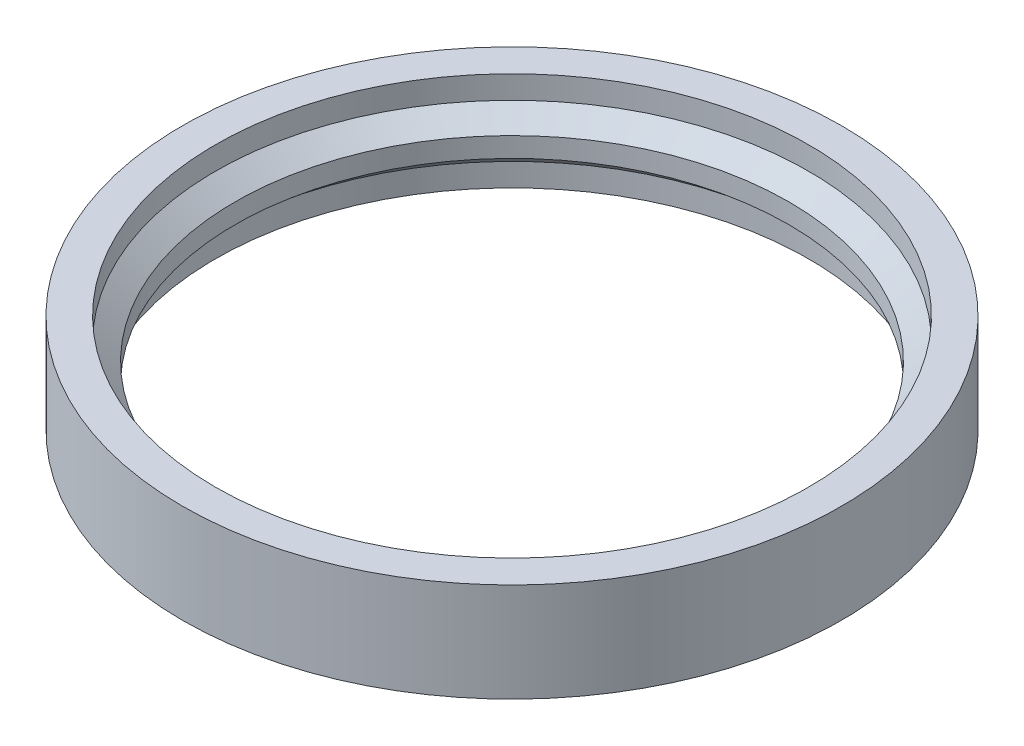
ISO-10303-21;
HEADER;
FILE_DESCRIPTION(('STEP AP214'),'2;1');
FILE_NAME('part.step','',(''),(''),'','','');
FILE_SCHEMA(('AUTOMOTIVE_DESIGN { 1 0 10303 214 1 1 1 1 }'));
ENDSEC;
DATA;
#1=APPLICATION_CONTEXT('core data for automotive mechanical design processes');
#2=APPLICATION_PROTOCOL_DEFINITION('international standard','automotive_design',2000,#1);
#3=PRODUCT_CONTEXT('',#1,'mechanical');
#4=PRODUCT('Part','Part','',(#3));
#5=PRODUCT_RELATED_PRODUCT_CATEGORY('part','',(#4));
#6=PRODUCT_DEFINITION_FORMATION('','',#4);
#7=PRODUCT_DEFINITION_CONTEXT('part definition',#1,'design');
#8=PRODUCT_DEFINITION('design','',#6,#7);
#9=PRODUCT_DEFINITION_SHAPE('','',#8);
#10=(LENGTH_UNIT() NAMED_UNIT(*) SI_UNIT(.MILLI.,.METRE.));
#11=(NAMED_UNIT(*) PLANE_ANGLE_UNIT() SI_UNIT($,.RADIAN.));
#12=(NAMED_UNIT(*) SI_UNIT($,.STERADIAN.) SOLID_ANGLE_UNIT());
#13=UNCERTAINTY_MEASURE_WITH_UNIT(LENGTH_MEASURE(1.E-05),#10,'distance_accuracy_value','');
#14=(GEOMETRIC_REPRESENTATION_CONTEXT(3) GLOBAL_UNCERTAINTY_ASSIGNED_CONTEXT((#13)) GLOBAL_UNIT_ASSIGNED_CONTEXT((#10,
#11,#12)) REPRESENTATION_CONTEXT('',''));
#15=CARTESIAN_POINT('',(0.,0.,0.));
#16=DIRECTION('',(0.,0.,1.));
#17=DIRECTION('',(1.,0.,0.));
#18=AXIS2_PLACEMENT_3D('',#15,#16,#17);
#19=CARTESIAN_POINT('',(0.,0.,0.));
#20=DIRECTION('',(0.,1.,0.));
#21=DIRECTION('',(0.,0.,1.));
#22=AXIS2_PLACEMENT_3D('',#19,#20,#21);
#23=PLANE('',#22);
#24=CARTESIAN_POINT('',(0.,0.,0.));
#25=DIRECTION('',(0.,1.,0.));
#26=DIRECTION('',(0.,0.,1.));
#27=AXIS2_PLACEMENT_3D('',#24,#25,#26);
#28=CIRCLE('',#27,50.);
#29=CARTESIAN_POINT('',(0.,0.,50.));
#30=VERTEX_POINT('',#29);
#31=EDGE_CURVE('E50',#30,#30,#28,.T.);
#32=ORIENTED_EDGE('',*,*,#31,.F.);
#33=EDGE_LOOP('',(#32));
#34=FACE_BOUND('',#33,.T.);
#35=CARTESIAN_POINT('',(0.,0.,0.));
#36=DIRECTION('',(0.,1.,0.));
#37=DIRECTION('',(0.,0.,1.));
#38=AXIS2_PLACEMENT_3D('',#35,#36,#37);
#39=CIRCLE('',#38,45.);
#40=CARTESIAN_POINT('',(0.,0.,45.));
#41=VERTEX_POINT('',#40);
#42=EDGE_CURVE('E63',#41,#41,#39,.T.);
#43=ORIENTED_EDGE('',*,*,#42,.T.);
#44=EDGE_LOOP('',(#43));
#45=FACE_BOUND('',#44,.T.);
#46=ADVANCED_FACE('F46',(#34,#45),#23,.F.);
#47=CARTESIAN_POINT('',(0.,15.,0.));
#48=DIRECTION('',(0.,1.,0.));
#49=DIRECTION('',(0.,0.,1.));
#50=AXIS2_PLACEMENT_3D('',#47,#48,#49);
#51=PLANE('',#50);
#52=CARTESIAN_POINT('',(0.,15.,0.));
#53=DIRECTION('',(0.,1.,0.));
#54=DIRECTION('',(0.,0.,1.));
#55=AXIS2_PLACEMENT_3D('',#52,#53,#54);
#56=CIRCLE('',#55,45.);
#57=CARTESIAN_POINT('',(0.,15.,45.));
#58=VERTEX_POINT('',#57);
#59=EDGE_CURVE('E62',#58,#58,#56,.T.);
#60=ORIENTED_EDGE('',*,*,#59,.F.);
#61=EDGE_LOOP('',(#60));
#62=FACE_BOUND('',#61,.T.);
#63=CARTESIAN_POINT('',(0.,15.,0.));
#64=DIRECTION('',(0.,1.,0.));
#65=DIRECTION('',(0.,0.,1.));
#66=AXIS2_PLACEMENT_3D('',#63,#64,#65);
#67=CIRCLE('',#66,50.);
#68=CARTESIAN_POINT('',(0.,15.,50.));
#69=VERTEX_POINT('',#68);
#70=EDGE_CURVE('E12',#69,#69,#67,.T.);
#71=ORIENTED_EDGE('',*,*,#70,.T.);
#72=EDGE_LOOP('',(#71));
#73=FACE_BOUND('',#72,.T.);
#74=ADVANCED_FACE('F79',(#62,#73),#51,.T.);
#75=CARTESIAN_POINT('',(0.,15.,0.));
#76=DIRECTION('',(0.,-1.,0.));
#77=DIRECTION('',(0.,0.,-1.));
#78=AXIS2_PLACEMENT_3D('',#75,#76,#77);
#79=CYLINDRICAL_SURFACE('',#78,50.);
#80=ORIENTED_EDGE('',*,*,#70,.F.);
#81=EDGE_LOOP('',(#80));
#82=FACE_BOUND('',#81,.T.);
#83=ORIENTED_EDGE('',*,*,#31,.T.);
#84=EDGE_LOOP('',(#83));
#85=FACE_BOUND('',#84,.T.);
#86=ADVANCED_FACE('F48',(#82,#85),#79,.T.);
#87=CARTESIAN_POINT('',(0.,3.48270110646817,0.));
#88=DIRECTION('',(0.,-1.,0.));
#89=DIRECTION('',(0.,0.,-1.));
#90=AXIS2_PLACEMENT_3D('',#87,#88,#89);
#91=CONICAL_SURFACE('',#90,45.,0.872664625997168);
#92=CARTESIAN_POINT('',(0.,6.,0.));
#93=DIRECTION('',(0.,1.,0.));
#94=DIRECTION('',(0.,0.,1.));
#95=AXIS2_PLACEMENT_3D('',#92,#93,#94);
#96=CIRCLE('',#95,42.);
#97=CARTESIAN_POINT('',(0.,6.,42.));
#98=VERTEX_POINT('',#97);
#99=EDGE_CURVE('E66',#98,#98,#96,.T.);
#100=ORIENTED_EDGE('',*,*,#99,.T.);
#101=EDGE_LOOP('',(#100));
#102=FACE_BOUND('',#101,.T.);
#103=CARTESIAN_POINT('',(0.,3.48270110646817,0.));
#104=DIRECTION('',(0.,1.,0.));
#105=DIRECTION('',(0.,0.,1.));
#106=AXIS2_PLACEMENT_3D('',#103,#104,#105);
#107=CIRCLE('',#106,45.);
#108=CARTESIAN_POINT('',(0.,3.48270110646817,45.));
#109=VERTEX_POINT('',#108);
#110=EDGE_CURVE('E59',#109,#109,#107,.T.);
#111=ORIENTED_EDGE('',*,*,#110,.F.);
#112=EDGE_LOOP('',(#111));
#113=FACE_BOUND('',#112,.T.);
#114=ADVANCED_FACE('F86',(#102,#113),#91,.F.);
#115=CARTESIAN_POINT('',(0.,3.83087885991326,0.));
#116=DIRECTION('',(0.,1.,0.));
#117=DIRECTION('',(0.,0.,1.));
#118=AXIS2_PLACEMENT_3D('',#115,#116,#117);
#119=CYLINDRICAL_SURFACE('',#118,45.);
#120=ORIENTED_EDGE('',*,*,#110,.T.);
#121=EDGE_LOOP('',(#120));
#122=FACE_BOUND('',#121,.T.);
#123=ORIENTED_EDGE('',*,*,#42,.F.);
#124=EDGE_LOOP('',(#123));
#125=FACE_BOUND('',#124,.T.);
#126=ADVANCED_FACE('F97',(#122,#125),#119,.F.);
#127=CARTESIAN_POINT('',(0.,3.83087885991326,0.));
#128=DIRECTION('',(0.,1.,0.));
#129=DIRECTION('',(0.,0.,1.));
#130=AXIS2_PLACEMENT_3D('',#127,#128,#129);
#131=CYLINDRICAL_SURFACE('',#130,45.);
#132=CARTESIAN_POINT('',(0.,11.5172988935318,0.));
#133=DIRECTION('',(0.,1.,0.));
#134=DIRECTION('',(0.,0.,1.));
#135=AXIS2_PLACEMENT_3D('',#132,#133,#134);
#136=CIRCLE('',#135,45.);
#137=CARTESIAN_POINT('',(0.,11.5172988935318,45.));
#138=VERTEX_POINT('',#137);
#139=EDGE_CURVE('E57',#138,#138,#136,.T.);
#140=ORIENTED_EDGE('',*,*,#139,.F.);
#141=EDGE_LOOP('',(#140));
#142=FACE_BOUND('',#141,.T.);
#143=ORIENTED_EDGE('',*,*,#59,.T.);
#144=EDGE_LOOP('',(#143));
#145=FACE_BOUND('',#144,.T.);
#146=ADVANCED_FACE('F77',(#142,#145),#131,.F.);
#147=CARTESIAN_POINT('',(0.,11.5172988935318,0.));
#148=DIRECTION('',(0.,1.,0.));
#149=DIRECTION('',(0.,0.,1.));
#150=AXIS2_PLACEMENT_3D('',#147,#148,#149);
#151=CONICAL_SURFACE('',#150,45.,0.872664625997167);
#152=CARTESIAN_POINT('',(0.,8.99999999999999,0.));
#153=DIRECTION('',(0.,1.,0.));
#154=DIRECTION('',(0.,0.,1.));
#155=AXIS2_PLACEMENT_3D('',#152,#153,#154);
#156=CIRCLE('',#155,42.);
#157=CARTESIAN_POINT('',(0.,8.99999999999999,42.));
#158=VERTEX_POINT('',#157);
#159=EDGE_CURVE('E71',#158,#158,#156,.T.);
#160=ORIENTED_EDGE('',*,*,#159,.F.);
#161=EDGE_LOOP('',(#160));
#162=FACE_BOUND('',#161,.T.);
#163=ORIENTED_EDGE('',*,*,#139,.T.);
#164=EDGE_LOOP('',(#163));
#165=FACE_BOUND('',#164,.T.);
#166=ADVANCED_FACE('F93',(#162,#165),#151,.F.);
#167=CARTESIAN_POINT('',(0.,15.,0.));
#168=DIRECTION('',(0.,-1.,0.));
#169=DIRECTION('',(0.,0.,-1.));
#170=AXIS2_PLACEMENT_3D('',#167,#168,#169);
#171=CYLINDRICAL_SURFACE('',#170,42.);
#172=ORIENTED_EDGE('',*,*,#159,.T.);
#173=EDGE_LOOP('',(#172));
#174=FACE_BOUND('',#173,.T.);
#175=ORIENTED_EDGE('',*,*,#99,.F.);
#176=EDGE_LOOP('',(#175));
#177=FACE_BOUND('',#176,.T.);
#178=ADVANCED_FACE('F90',(#174,#177),#171,.F.);
#179=CLOSED_SHELL('',(#46,#74,#86,#114,#126,#146,#166,#178));
#180=MANIFOLD_SOLID_BREP('B2',#179);
#181=ADVANCED_BREP_SHAPE_REPRESENTATION('',(#18,#180),#14);
#182=SHAPE_DEFINITION_REPRESENTATION(#9,#181);
ENDSEC;
END-ISO-10303-21;
